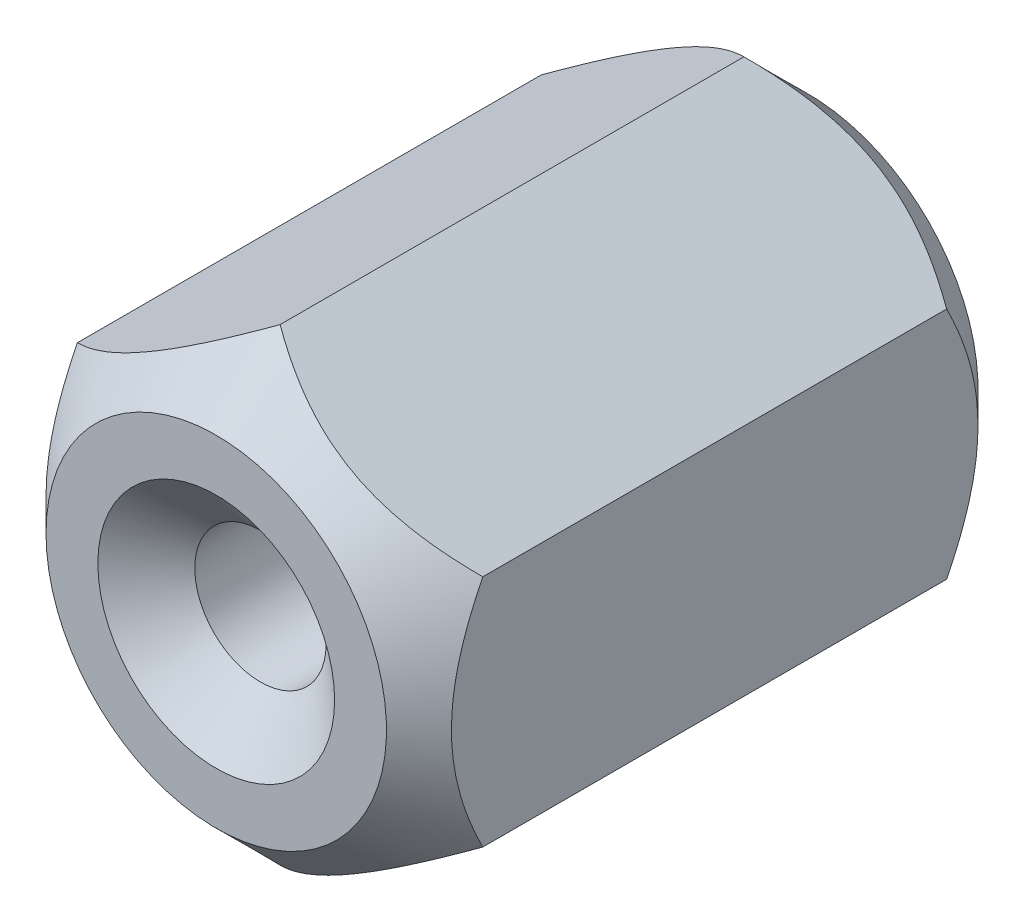
ISO-10303-21;
HEADER;
FILE_DESCRIPTION(('STEP AP214'),'2;1');
FILE_NAME('part.step','',(''),(''),'','','');
FILE_SCHEMA(('AUTOMOTIVE_DESIGN { 1 0 10303 214 1 1 1 1 }'));
ENDSEC;
DATA;
#1=APPLICATION_CONTEXT('core data for automotive mechanical design processes');
#2=APPLICATION_PROTOCOL_DEFINITION('international standard','automotive_design',2000,#1);
#3=PRODUCT_CONTEXT('',#1,'mechanical');
#4=PRODUCT('Part','Part','',(#3));
#5=PRODUCT_RELATED_PRODUCT_CATEGORY('part','',(#4));
#6=PRODUCT_DEFINITION_FORMATION('','',#4);
#7=PRODUCT_DEFINITION_CONTEXT('part definition',#1,'design');
#8=PRODUCT_DEFINITION('design','',#6,#7);
#9=PRODUCT_DEFINITION_SHAPE('','',#8);
#10=(LENGTH_UNIT() NAMED_UNIT(*) SI_UNIT(.MILLI.,.METRE.));
#11=(NAMED_UNIT(*) PLANE_ANGLE_UNIT() SI_UNIT($,.RADIAN.));
#12=(NAMED_UNIT(*) SI_UNIT($,.STERADIAN.) SOLID_ANGLE_UNIT());
#13=UNCERTAINTY_MEASURE_WITH_UNIT(LENGTH_MEASURE(1.E-05),#10,'distance_accuracy_value','');
#14=(GEOMETRIC_REPRESENTATION_CONTEXT(3) GLOBAL_UNCERTAINTY_ASSIGNED_CONTEXT((#13)) GLOBAL_UNIT_ASSIGNED_CONTEXT((#10,
#11,#12)) REPRESENTATION_CONTEXT('',''));
#15=CARTESIAN_POINT('',(0.,0.,0.));
#16=DIRECTION('',(0.,0.,1.));
#17=DIRECTION('',(1.,0.,0.));
#18=AXIS2_PLACEMENT_3D('',#15,#16,#17);
#19=CARTESIAN_POINT('',(0.,-3.66617420935412,-4.6325));
#20=DIRECTION('',(0.5,-0.866025403784439,0.));
#21=DIRECTION('',(0.866025403784439,0.5,0.));
#22=AXIS2_PLACEMENT_3D('',#19,#20,#21);
#23=PLANE('',#22);
#24=CARTESIAN_POINT('',(3.1752,-1.83297163462323,-3.63238452449106));
#25=CARTESIAN_POINT('',(3.06606165005017,-1.89598269034567,-3.69534101630822));
#26=CARTESIAN_POINT('',(2.95509837192205,-1.9600473688431,-3.75459989576525));
#27=CARTESIAN_POINT('',(2.72883215365405,-2.09068223086865,-3.86310134426944));
#28=CARTESIAN_POINT('',(2.61350769674774,-2.15726483710766,-3.91228354606129));
#29=CARTESIAN_POINT('',(2.38096147751937,-2.29152545937819,-3.99653354112599));
#30=CARTESIAN_POINT('',(2.26379893371885,-2.35916928558036,-4.03181308550055));
#31=CARTESIAN_POINT('',(2.02689455535372,-2.49594609220167,-4.08616842986518));
#32=CARTESIAN_POINT('',(1.90715995735644,-2.56507489458671,-4.10528480247036));
#33=CARTESIAN_POINT('',(1.70080208124842,-2.68421566990708,-4.12253286937675));
#34=CARTESIAN_POINT('',(1.61444529227084,-2.73407378526963,-4.12508606638618));
#35=CARTESIAN_POINT('',(1.44187218347528,-2.83370891608764,-4.12078372687673));
#36=CARTESIAN_POINT('',(1.35565592350719,-2.88348589698874,-4.11392489197855));
#37=CARTESIAN_POINT('',(1.18404020841286,-2.98256827629562,-4.09119011669629));
#38=CARTESIAN_POINT('',(1.09864177574672,-3.03187308438379,-4.07530409031272));
#39=CARTESIAN_POINT('',(0.929311596694514,-3.12963590884151,-4.03538201600204));
#40=CARTESIAN_POINT('',(0.845379738380239,-3.17809398983284,-4.01134659291482));
#41=CARTESIAN_POINT('',(0.696376420715872,-3.26412109539651,-3.96189476558283));
#42=CARTESIAN_POINT('',(0.630975148808257,-3.30188053733771,-3.93777828069901));
#43=CARTESIAN_POINT('',(0.501346749794884,-3.3767215284027,-3.88565853286284));
#44=CARTESIAN_POINT('',(0.437119658558268,-3.41380305681743,-3.85765515139647));
#45=CARTESIAN_POINT('',(0.310041965487393,-3.4871713971199,-3.79838943445549));
#46=CARTESIAN_POINT('',(0.24718774925127,-3.52346029578352,-3.76713734664579));
#47=CARTESIAN_POINT('',(0.122643379151904,-3.59536602138645,-3.70178465560807));
#48=CARTESIAN_POINT('',(0.0609525390212886,-3.63098324454239,-3.66768580048145));
#49=CARTESIAN_POINT('',(-0.000200000000000683,-3.66628967940796,-3.63238452449106));
#50=B_SPLINE_CURVE_WITH_KNOTS('',3,(#24,#25,#26,#27,#28,#29,#30,#31,#32,#33,#34,#35,#36,#37,#38,
#39,#40,#41,#42,#43,#44,#45,#46,#47,#48,#49),.UNSPECIFIED.,.F.,.F.,(4,2,2,2,2,2,2,2,2,2,2,2,4),
(0.,0.422910572436808,0.848285055427808,1.26690402276127,1.68446903107506,1.98329272958352,
2.28222117546891,2.58148426995467,2.88072442418453,3.11844134429547,3.35616551414406,
3.59316134346767,3.83001269744429),.UNSPECIFIED.);
#51=CARTESIAN_POINT('',(3.175,-1.83308710467706,-3.6325));
#52=VERTEX_POINT('',#51);
#53=CARTESIAN_POINT('',(0.,-3.66617420935412,-3.6325));
#54=VERTEX_POINT('',#53);
#55=EDGE_CURVE('E214',#52,#54,#50,.T.);
#56=ORIENTED_EDGE('',*,*,#55,.F.);
#57=DIRECTION('',(0.,0.,1.));
#58=VECTOR('',#57,1.);
#59=CARTESIAN_POINT('',(3.175,-1.83308710467706,-4.6325));
#60=LINE('',#59,#58);
#61=CARTESIAN_POINT('',(3.175,-1.83308710467706,3.6325));
#62=VERTEX_POINT('',#61);
#63=EDGE_CURVE('E43',#52,#62,#60,.T.);
#64=ORIENTED_EDGE('',*,*,#63,.T.);
#65=CARTESIAN_POINT('',(-0.000200000000000684,-3.66628967940796,3.63238452449106));
#66=CARTESIAN_POINT('',(0.108938349949826,-3.60327862368552,3.69534101630822));
#67=CARTESIAN_POINT('',(0.219901628077945,-3.53921394518808,3.75459989576526));
#68=CARTESIAN_POINT('',(0.446167846345948,-3.40857908316253,3.86310134426944));
#69=CARTESIAN_POINT('',(0.561492303252265,-3.34199647692353,3.91228354606129));
#70=CARTESIAN_POINT('',(0.794038522480629,-3.207735854653,3.99653354112599));
#71=CARTESIAN_POINT('',(0.911201066281154,-3.14009202845083,4.03181308550055));
#72=CARTESIAN_POINT('',(1.14810544464629,-3.00331522182952,4.08616842986518));
#73=CARTESIAN_POINT('',(1.26784004264356,-2.93418641944448,4.10528480247036));
#74=CARTESIAN_POINT('',(1.47419791875159,-2.81504564412411,4.12253286937675));
#75=CARTESIAN_POINT('',(1.56055470772916,-2.76518752876155,4.12508606638618));
#76=CARTESIAN_POINT('',(1.73312781652473,-2.66555239794355,4.12078372687673));
#77=CARTESIAN_POINT('',(1.81934407649281,-2.61577541704245,4.11392489197855));
#78=CARTESIAN_POINT('',(1.99095979158714,-2.51669303773557,4.09119011669629));
#79=CARTESIAN_POINT('',(2.07635822425329,-2.4673882296474,4.07530409031271));
#80=CARTESIAN_POINT('',(2.24568840330549,-2.36962540518968,4.03538201600204));
#81=CARTESIAN_POINT('',(2.32962026161976,-2.32116732419835,4.01134659291482));
#82=CARTESIAN_POINT('',(2.47862357928413,-2.23514021863468,3.96189476558283));
#83=CARTESIAN_POINT('',(2.54402485119175,-2.19738077669347,3.937778280699));
#84=CARTESIAN_POINT('',(2.67365325020512,-2.12253978562848,3.88565853286284));
#85=CARTESIAN_POINT('',(2.73788034144173,-2.08545825721376,3.85765515139647));
#86=CARTESIAN_POINT('',(2.86495803451261,-2.01208991691129,3.79838943445549));
#87=CARTESIAN_POINT('',(2.92781225074873,-1.97580101824766,3.76713734664579));
#88=CARTESIAN_POINT('',(3.0523566208481,-1.90389529264474,3.70178465560807));
#89=CARTESIAN_POINT('',(3.11404746097871,-1.8682780694888,3.66768580048145));
#90=CARTESIAN_POINT('',(3.1752,-1.83297163462323,3.63238452449106));
#91=B_SPLINE_CURVE_WITH_KNOTS('',3,(#65,#66,#67,#68,#69,#70,#71,#72,#73,#74,#75,#76,#77,#78,#79,
#80,#81,#82,#83,#84,#85,#86,#87,#88,#89,#90),.UNSPECIFIED.,.F.,.F.,(4,2,2,2,2,2,2,2,2,2,2,2,4),
(0.,0.42291057243681,0.848285055427811,1.26690402276128,1.68446903107507,1.98329272958353,
2.28222117546892,2.58148426995467,2.88072442418454,3.11844134429547,3.35616551414406,
3.59316134346767,3.83001269744429),.UNSPECIFIED.);
#92=CARTESIAN_POINT('',(0.,-3.66617420935412,3.6325));
#93=VERTEX_POINT('',#92);
#94=EDGE_CURVE('E131',#93,#62,#91,.T.);
#95=ORIENTED_EDGE('',*,*,#94,.F.);
#96=DIRECTION('',(0.,0.,1.));
#97=VECTOR('',#96,1.);
#98=CARTESIAN_POINT('',(0.,-3.66617420935412,-4.6325));
#99=LINE('',#98,#97);
#100=EDGE_CURVE('E11',#54,#93,#99,.T.);
#101=ORIENTED_EDGE('',*,*,#100,.F.);
#102=EDGE_LOOP('',(#56,#64,#95,#101));
#103=FACE_BOUND('',#102,.T.);
#104=ADVANCED_FACE('F39',(#103),#23,.T.);
#105=CARTESIAN_POINT('',(-3.175,-1.83308710467706,-4.6325));
#106=DIRECTION('',(-0.5,-0.866025403784438,0.));
#107=DIRECTION('',(0.866025403784439,-0.5,0.));
#108=AXIS2_PLACEMENT_3D('',#105,#106,#107);
#109=PLANE('',#108);
#110=CARTESIAN_POINT('',(0.000199999999999404,-3.66628967940796,-3.63238452449106));
#111=CARTESIAN_POINT('',(-0.108938349949827,-3.60327862368552,-3.69534101630822));
#112=CARTESIAN_POINT('',(-0.219901628077947,-3.53921394518808,-3.75459989576526));
#113=CARTESIAN_POINT('',(-0.446167846345949,-3.40857908316253,-3.86310134426944));
#114=CARTESIAN_POINT('',(-0.561492303252266,-3.34199647692352,-3.91228354606129));
#115=CARTESIAN_POINT('',(-0.79403852248063,-3.207735854653,-3.996533541126));
#116=CARTESIAN_POINT('',(-0.911201066281154,-3.14009202845082,-4.03181308550055));
#117=CARTESIAN_POINT('',(-1.14810544464629,-3.00331522182951,-4.08616842986518));
#118=CARTESIAN_POINT('',(-1.26784004264356,-2.93418641944448,-4.10528480247036));
#119=CARTESIAN_POINT('',(-1.47419791875159,-2.81504564412411,-4.12253286937675));
#120=CARTESIAN_POINT('',(-1.56055470772916,-2.76518752876155,-4.12508606638618));
#121=CARTESIAN_POINT('',(-1.73312781652473,-2.66555239794354,-4.12078372687673));
#122=CARTESIAN_POINT('',(-1.81934407649281,-2.61577541704245,-4.11392489197855));
#123=CARTESIAN_POINT('',(-1.99095979158714,-2.51669303773557,-4.09119011669629));
#124=CARTESIAN_POINT('',(-2.07635822425329,-2.46738822964739,-4.07530409031272));
#125=CARTESIAN_POINT('',(-2.24568840330549,-2.36962540518968,-4.03538201600204));
#126=CARTESIAN_POINT('',(-2.32962026161976,-2.32116732419835,-4.01134659291482));
#127=CARTESIAN_POINT('',(-2.47862357928413,-2.23514021863468,-3.96189476558283));
#128=CARTESIAN_POINT('',(-2.54402485119175,-2.19738077669347,-3.93777828069901));
#129=CARTESIAN_POINT('',(-2.67365325020512,-2.12253978562848,-3.88565853286284));
#130=CARTESIAN_POINT('',(-2.73788034144173,-2.08545825721375,-3.85765515139647));
#131=CARTESIAN_POINT('',(-2.86495803451261,-2.01208991691129,-3.79838943445549));
#132=CARTESIAN_POINT('',(-2.92781225074873,-1.97580101824766,-3.76713734664579));
#133=CARTESIAN_POINT('',(-3.0523566208481,-1.90389529264474,-3.70178465560807));
#134=CARTESIAN_POINT('',(-3.11404746097871,-1.86827806948879,-3.66768580048145));
#135=CARTESIAN_POINT('',(-3.1752,-1.83297163462322,-3.63238452449106));
#136=B_SPLINE_CURVE_WITH_KNOTS('',3,(#110,#111,#112,#113,#114,#115,#116,#117,#118,#119,#120,
#121,#122,#123,#124,#125,#126,#127,#128,#129,#130,#131,#132,#133,#134,#135),.UNSPECIFIED.,.F.,
.F.,(4,2,2,2,2,2,2,2,2,2,2,2,4),(0.,0.42291057243681,0.848285055427811,1.26690402276128,
1.68446903107507,1.98329272958352,2.28222117546891,2.58148426995467,2.88072442418453,
3.11844134429547,3.35616551414406,3.59316134346767,3.83001269744429),.UNSPECIFIED.);
#137=CARTESIAN_POINT('',(-3.175,-1.83308710467706,-3.6325));
#138=VERTEX_POINT('',#137);
#139=EDGE_CURVE('E99',#54,#138,#136,.T.);
#140=ORIENTED_EDGE('',*,*,#139,.F.);
#141=ORIENTED_EDGE('',*,*,#100,.T.);
#142=CARTESIAN_POINT('',(-3.1752,-1.83297163462322,3.63238452449106));
#143=CARTESIAN_POINT('',(-3.06606165005017,-1.89598269034567,3.69534101630822));
#144=CARTESIAN_POINT('',(-2.95509837192205,-1.9600473688431,3.75459989576526));
#145=CARTESIAN_POINT('',(-2.72883215365405,-2.09068223086865,3.86310134426944));
#146=CARTESIAN_POINT('',(-2.61350769674773,-2.15726483710766,3.91228354606129));
#147=CARTESIAN_POINT('',(-2.38096147751937,-2.29152545937819,3.996533541126));
#148=CARTESIAN_POINT('',(-2.26379893371885,-2.35916928558036,4.03181308550055));
#149=CARTESIAN_POINT('',(-2.02689455535371,-2.49594609220167,4.08616842986518));
#150=CARTESIAN_POINT('',(-1.90715995735644,-2.56507489458671,4.10528480247036));
#151=CARTESIAN_POINT('',(-1.70080208124841,-2.68421566990708,4.12253286937675));
#152=CARTESIAN_POINT('',(-1.61444529227084,-2.73407378526963,4.12508606638618));
#153=CARTESIAN_POINT('',(-1.44187218347527,-2.83370891608764,4.12078372687673));
#154=CARTESIAN_POINT('',(-1.35565592350719,-2.88348589698874,4.11392489197855));
#155=CARTESIAN_POINT('',(-1.18404020841286,-2.98256827629562,4.09119011669629));
#156=CARTESIAN_POINT('',(-1.09864177574671,-3.03187308438379,4.07530409031272));
#157=CARTESIAN_POINT('',(-0.929311596694512,-3.12963590884151,4.03538201600204));
#158=CARTESIAN_POINT('',(-0.845379738380237,-3.17809398983284,4.01134659291482));
#159=CARTESIAN_POINT('',(-0.69637642071587,-3.26412109539651,3.96189476558283));
#160=CARTESIAN_POINT('',(-0.630975148808255,-3.30188053733771,3.93777828069901));
#161=CARTESIAN_POINT('',(-0.501346749794883,-3.3767215284027,3.88565853286284));
#162=CARTESIAN_POINT('',(-0.437119658558267,-3.41380305681743,3.85765515139647));
#163=CARTESIAN_POINT('',(-0.310041965487394,-3.4871713971199,3.79838943445549));
#164=CARTESIAN_POINT('',(-0.247187749251271,-3.52346029578352,3.76713734664579));
#165=CARTESIAN_POINT('',(-0.122643379151905,-3.59536602138645,3.70178465560807));
#166=CARTESIAN_POINT('',(-0.06095253902129,-3.63098324454239,3.66768580048145));
#167=CARTESIAN_POINT('',(0.000199999999999069,-3.66628967940796,3.63238452449106));
#168=B_SPLINE_CURVE_WITH_KNOTS('',3,(#142,#143,#144,#145,#146,#147,#148,#149,#150,#151,#152,
#153,#154,#155,#156,#157,#158,#159,#160,#161,#162,#163,#164,#165,#166,#167),.UNSPECIFIED.,.F.,
.F.,(4,2,2,2,2,2,2,2,2,2,2,2,4),(0.,0.42291057243681,0.848285055427811,1.26690402276128,
1.68446903107507,1.98329272958352,2.28222117546891,2.58148426995467,2.88072442418453,
3.11844134429547,3.35616551414406,3.59316134346767,3.83001269744429),.UNSPECIFIED.);
#169=CARTESIAN_POINT('',(-3.175,-1.83308710467706,3.6325));
#170=VERTEX_POINT('',#169);
#171=EDGE_CURVE('E133',#170,#93,#168,.T.);
#172=ORIENTED_EDGE('',*,*,#171,.F.);
#173=DIRECTION('',(0.,0.,1.));
#174=VECTOR('',#173,1.);
#175=CARTESIAN_POINT('',(-3.175,-1.83308710467706,-4.6325));
#176=LINE('',#175,#174);
#177=EDGE_CURVE('E49',#138,#170,#176,.T.);
#178=ORIENTED_EDGE('',*,*,#177,.F.);
#179=EDGE_LOOP('',(#140,#141,#172,#178));
#180=FACE_BOUND('',#179,.T.);
#181=ADVANCED_FACE('F194',(#180),#109,.T.);
#182=CARTESIAN_POINT('',(-3.175,1.83308710467706,-4.6325));
#183=DIRECTION('',(-1.,0.,0.));
#184=DIRECTION('',(0.,-1.,0.));
#185=AXIS2_PLACEMENT_3D('',#182,#183,#184);
#186=PLANE('',#185);
#187=CARTESIAN_POINT('',(-3.175,-3.62314366162436,-2.48122727215091));
#188=CARTESIAN_POINT('',(-3.175,-3.53477477471413,-2.54767330066197));
#189=CARTESIAN_POINT('',(-3.175,-3.44590747401783,-2.61346732929089));
#190=CARTESIAN_POINT('',(-3.175,-3.26698086109357,-2.74346065674581));
#191=CARTESIAN_POINT('',(-3.175,-3.17692125186334,-2.80765954631578));
#192=CARTESIAN_POINT('',(-3.175,-2.99475622996979,-2.93462801376402));
#193=CARTESIAN_POINT('',(-3.175,-2.90264037042889,-2.99738265440275));
#194=CARTESIAN_POINT('',(-3.175,-2.71683951537136,-3.1205168325571));
#195=CARTESIAN_POINT('',(-3.175,-2.62315463201829,-3.18089653882317));
#196=CARTESIAN_POINT('',(-3.175,-2.42867521304995,-3.30205311497214));
#197=CARTESIAN_POINT('',(-3.175,-2.327776197965,-3.36266312895682));
#198=CARTESIAN_POINT('',(-3.175,-2.1236266416231,-3.47984891241029));
#199=CARTESIAN_POINT('',(-3.175,-2.02037573570296,-3.53642405057174));
#200=CARTESIAN_POINT('',(-3.175,-1.81153946353305,-3.64431638181168));
#201=CARTESIAN_POINT('',(-3.175,-1.70596214797143,-3.69564903574252));
#202=CARTESIAN_POINT('',(-3.175,-1.49194968831593,-3.79190753599678));
#203=CARTESIAN_POINT('',(-3.175,-1.38351585328126,-3.83683625855787));
#204=CARTESIAN_POINT('',(-3.175,-1.17206906194383,-3.91555402653428));
#205=CARTESIAN_POINT('',(-3.175,-1.06927808219159,-3.9499331189904));
#206=CARTESIAN_POINT('',(-3.175,-0.861249989752693,-4.01044018821902));
#207=CARTESIAN_POINT('',(-3.175,-0.756012706347597,-4.03656758726936));
#208=CARTESIAN_POINT('',(-3.175,-0.545455116385145,-4.07878154980003));
#209=CARTESIAN_POINT('',(-3.175,-0.440169465308187,-4.09503816718227));
#210=CARTESIAN_POINT('',(-3.175,-0.228508692793317,-4.11720019179704));
#211=CARTESIAN_POINT('',(-3.175,-0.122133754622792,-4.12310731241113));
#212=CARTESIAN_POINT('',(-3.175,0.086957796837713,-4.12414473816365));
#213=CARTESIAN_POINT('',(-3.175,0.189672720284836,-4.11964340706931));
#214=CARTESIAN_POINT('',(-3.175,0.394206632826208,-4.10091780352249));
#215=CARTESIAN_POINT('',(-3.175,0.496025532914314,-4.08669257595037));
#216=CARTESIAN_POINT('',(-3.175,0.699751411908735,-4.04904774602645));
#217=CARTESIAN_POINT('',(-3.175,0.801629229158969,-4.0254728022883));
#218=CARTESIAN_POINT('',(-3.175,1.00316901022372,-3.97037603830061));
#219=CARTESIAN_POINT('',(-3.175,1.10283116972946,-3.93885492293116));
#220=CARTESIAN_POINT('',(-3.175,1.30972972723242,-3.865639745003));
#221=CARTESIAN_POINT('',(-3.175,1.41671377003006,-3.82323954984725));
#222=CARTESIAN_POINT('',(-3.175,1.62788222750015,-3.7319455092361));
#223=CARTESIAN_POINT('',(-3.175,1.73206568079257,-3.68304946728032));
#224=CARTESIAN_POINT('',(-3.175,1.93816752656033,-3.5799201972936));
#225=CARTESIAN_POINT('',(-3.175,2.04007726416977,-3.52566981162605));
#226=CARTESIAN_POINT('',(-3.175,2.24154914453307,-3.41303481703511));
#227=CARTESIAN_POINT('',(-3.175,2.34111165997837,-3.35465087041164));
#228=CARTESIAN_POINT('',(-3.175,2.53328789139578,-3.23755822864378));
#229=CARTESIAN_POINT('',(-3.175,2.62600050272272,-3.17901098750221));
#230=CARTESIAN_POINT('',(-3.175,2.80983442239984,-3.05946182904578));
#231=CARTESIAN_POINT('',(-3.175,2.90095560921207,-2.99845972541707));
#232=CARTESIAN_POINT('',(-3.175,3.08107470813498,-2.87494540123562));
#233=CARTESIAN_POINT('',(-3.175,3.1700838687153,-2.81244952545103));
#234=CARTESIAN_POINT('',(-3.175,3.34688695470737,-2.68581054967444));
#235=CARTESIAN_POINT('',(-3.175,3.43468120733686,-2.62166790704841));
#236=CARTESIAN_POINT('',(-3.175,3.52196693533842,-2.55685218679603));
#237=B_SPLINE_CURVE_WITH_KNOTS('',3,(#187,#188,#189,#190,#191,#192,#193,#194,#195,#196,#197,
#198,#199,#200,#201,#202,#203,#204,#205,#206,#207,#208,#209,#210,#211,#212,#213,#214,#215,#216,
#217,#218,#219,#220,#221,#222,#223,#224,#225,#226,#227,#228,#229,#230,#231,#232,#233,#234,#235,
#236),.UNSPECIFIED.,.F.,.F.,(4,2,2,2,2,2,2,2,2,2,2,2,2,2,2,2,2,2,2,2,2,2,2,2,4),(0.,
0.331695086033258,0.663474412411203,0.997825593478521,1.33215297421855,1.68518935827853,
2.03828085871132,2.39029899374214,2.74215852308448,3.06703502033416,3.39193425797894,
3.71106436530982,4.03014163496714,4.33810010599997,4.64608883028139,4.95942473763719,
5.27273285971666,5.61770254927929,5.96278918493366,6.30901993384334,6.65519533292016,
6.98410375942931,7.31303719597191,7.63929174244195,7.96545663622252),.UNSPECIFIED.);
#238=CARTESIAN_POINT('',(-3.175,1.83308710467706,-3.6325));
#239=VERTEX_POINT('',#238);
#240=EDGE_CURVE('E93',#138,#239,#237,.T.);
#241=ORIENTED_EDGE('',*,*,#240,.F.);
#242=ORIENTED_EDGE('',*,*,#177,.T.);
#243=CARTESIAN_POINT('',(-3.175,-3.62314366162436,2.48122727215091));
#244=CARTESIAN_POINT('',(-3.175,-3.53477477471413,2.54767330066197));
#245=CARTESIAN_POINT('',(-3.175,-3.44590747401783,2.61346732929089));
#246=CARTESIAN_POINT('',(-3.175,-3.26698086109357,2.74346065674581));
#247=CARTESIAN_POINT('',(-3.175,-3.17692125186334,2.80765954631578));
#248=CARTESIAN_POINT('',(-3.175,-2.99475622996979,2.93462801376402));
#249=CARTESIAN_POINT('',(-3.175,-2.90264037042889,2.99738265440275));
#250=CARTESIAN_POINT('',(-3.175,-2.71683951537136,3.1205168325571));
#251=CARTESIAN_POINT('',(-3.175,-2.62315463201829,3.18089653882317));
#252=CARTESIAN_POINT('',(-3.175,-2.42867521304995,3.30205311497214));
#253=CARTESIAN_POINT('',(-3.175,-2.327776197965,3.36266312895682));
#254=CARTESIAN_POINT('',(-3.175,-2.1236266416231,3.47984891241029));
#255=CARTESIAN_POINT('',(-3.175,-2.02037573570296,3.53642405057174));
#256=CARTESIAN_POINT('',(-3.175,-1.81153946353305,3.64431638181168));
#257=CARTESIAN_POINT('',(-3.175,-1.70596214797143,3.69564903574252));
#258=CARTESIAN_POINT('',(-3.175,-1.49194968831593,3.79190753599678));
#259=CARTESIAN_POINT('',(-3.175,-1.38351585328126,3.83683625855787));
#260=CARTESIAN_POINT('',(-3.175,-1.17206906194383,3.91555402653428));
#261=CARTESIAN_POINT('',(-3.175,-1.06927808219159,3.9499331189904));
#262=CARTESIAN_POINT('',(-3.175,-0.861249989752693,4.01044018821902));
#263=CARTESIAN_POINT('',(-3.175,-0.756012706347597,4.03656758726936));
#264=CARTESIAN_POINT('',(-3.175,-0.545455116385145,4.07878154980003));
#265=CARTESIAN_POINT('',(-3.175,-0.440169465308187,4.09503816718227));
#266=CARTESIAN_POINT('',(-3.175,-0.228508692793317,4.11720019179704));
#267=CARTESIAN_POINT('',(-3.175,-0.122133754622792,4.12310731241113));
#268=CARTESIAN_POINT('',(-3.175,0.086957796837713,4.12414473816365));
#269=CARTESIAN_POINT('',(-3.175,0.189672720284836,4.11964340706931));
#270=CARTESIAN_POINT('',(-3.175,0.394206632826208,4.10091780352249));
#271=CARTESIAN_POINT('',(-3.175,0.496025532914314,4.08669257595037));
#272=CARTESIAN_POINT('',(-3.175,0.699751411908735,4.04904774602645));
#273=CARTESIAN_POINT('',(-3.175,0.801629229158969,4.0254728022883));
#274=CARTESIAN_POINT('',(-3.175,1.00316901022372,3.97037603830061));
#275=CARTESIAN_POINT('',(-3.175,1.10283116972946,3.93885492293116));
#276=CARTESIAN_POINT('',(-3.175,1.30972972723242,3.865639745003));
#277=CARTESIAN_POINT('',(-3.175,1.41671377003006,3.82323954984725));
#278=CARTESIAN_POINT('',(-3.175,1.62788222750015,3.7319455092361));
#279=CARTESIAN_POINT('',(-3.175,1.73206568079257,3.68304946728032));
#280=CARTESIAN_POINT('',(-3.175,1.93816752656033,3.5799201972936));
#281=CARTESIAN_POINT('',(-3.175,2.04007726416977,3.52566981162605));
#282=CARTESIAN_POINT('',(-3.175,2.24154914453307,3.41303481703511));
#283=CARTESIAN_POINT('',(-3.175,2.34111165997837,3.35465087041164));
#284=CARTESIAN_POINT('',(-3.175,2.53328789139578,3.23755822864378));
#285=CARTESIAN_POINT('',(-3.175,2.62600050272272,3.17901098750221));
#286=CARTESIAN_POINT('',(-3.175,2.80983442239984,3.05946182904578));
#287=CARTESIAN_POINT('',(-3.175,2.90095560921207,2.99845972541707));
#288=CARTESIAN_POINT('',(-3.175,3.08107470813498,2.87494540123562));
#289=CARTESIAN_POINT('',(-3.175,3.1700838687153,2.81244952545103));
#290=CARTESIAN_POINT('',(-3.175,3.34688695470737,2.68581054967444));
#291=CARTESIAN_POINT('',(-3.175,3.43468120733686,2.62166790704841));
#292=CARTESIAN_POINT('',(-3.175,3.52196693533842,2.55685218679603));
#293=B_SPLINE_CURVE_WITH_KNOTS('',3,(#243,#244,#245,#246,#247,#248,#249,#250,#251,#252,#253,
#254,#255,#256,#257,#258,#259,#260,#261,#262,#263,#264,#265,#266,#267,#268,#269,#270,#271,#272,
#273,#274,#275,#276,#277,#278,#279,#280,#281,#282,#283,#284,#285,#286,#287,#288,#289,#290,#291,
#292),.UNSPECIFIED.,.F.,.F.,(4,2,2,2,2,2,2,2,2,2,2,2,2,2,2,2,2,2,2,2,2,2,2,2,4),(0.,
0.331695086033258,0.663474412411203,0.997825593478521,1.33215297421855,1.68518935827853,
2.03828085871132,2.39029899374214,2.74215852308448,3.06703502033416,3.39193425797894,
3.71106436530982,4.03014163496714,4.33810010599997,4.64608883028139,4.95942473763719,
5.27273285971666,5.61770254927929,5.96278918493366,6.30901993384334,6.65519533292016,
6.98410375942931,7.31303719597191,7.63929174244195,7.96545663622252),.UNSPECIFIED.);
#294=CARTESIAN_POINT('',(-3.175,1.83308710467706,3.6325));
#295=VERTEX_POINT('',#294);
#296=EDGE_CURVE('E117',#295,#170,#293,.F.);
#297=ORIENTED_EDGE('',*,*,#296,.F.);
#298=DIRECTION('',(0.,0.,1.));
#299=VECTOR('',#298,1.);
#300=CARTESIAN_POINT('',(-3.175,1.83308710467706,-4.6325));
#301=LINE('',#300,#299);
#302=EDGE_CURVE('E109',#239,#295,#301,.T.);
#303=ORIENTED_EDGE('',*,*,#302,.F.);
#304=EDGE_LOOP('',(#241,#242,#297,#303));
#305=FACE_BOUND('',#304,.T.);
#306=ADVANCED_FACE('F115',(#305),#186,.T.);
#307=CARTESIAN_POINT('',(0.,3.66617420935412,-4.6325));
#308=DIRECTION('',(-0.5,0.866025403784439,0.));
#309=DIRECTION('',(-0.866025403784439,-0.5,0.));
#310=AXIS2_PLACEMENT_3D('',#307,#308,#309);
#311=PLANE('',#310);
#312=CARTESIAN_POINT('',(-3.1752,1.83297163462323,-3.63238452449106));
#313=CARTESIAN_POINT('',(-3.06606165005017,1.89598269034567,-3.69534101630822));
#314=CARTESIAN_POINT('',(-2.95509837192205,1.9600473688431,-3.75459989576526));
#315=CARTESIAN_POINT('',(-2.72883215365405,2.09068223086865,-3.86310134426944));
#316=CARTESIAN_POINT('',(-2.61350769674773,2.15726483710766,-3.91228354606129));
#317=CARTESIAN_POINT('',(-2.38096147751937,2.29152545937819,-3.996533541126));
#318=CARTESIAN_POINT('',(-2.26379893371884,2.35916928558036,-4.03181308550055));
#319=CARTESIAN_POINT('',(-2.02689455535371,2.49594609220167,-4.08616842986518));
#320=CARTESIAN_POINT('',(-1.90715995735644,2.56507489458671,-4.10528480247036));
#321=CARTESIAN_POINT('',(-1.70080208124841,2.68421566990708,-4.12253286937675));
#322=CARTESIAN_POINT('',(-1.61444529227084,2.73407378526963,-4.12508606638618));
#323=CARTESIAN_POINT('',(-1.44187218347527,2.83370891608764,-4.12078372687673));
#324=CARTESIAN_POINT('',(-1.35565592350718,2.88348589698874,-4.11392489197855));
#325=CARTESIAN_POINT('',(-1.18404020841286,2.98256827629562,-4.09119011669629));
#326=CARTESIAN_POINT('',(-1.09864177574671,3.03187308438379,-4.07530409031272));
#327=CARTESIAN_POINT('',(-0.92931159669451,3.12963590884151,-4.03538201600204));
#328=CARTESIAN_POINT('',(-0.845379738380234,3.17809398983284,-4.01134659291482));
#329=CARTESIAN_POINT('',(-0.696376420715867,3.26412109539651,-3.96189476558283));
#330=CARTESIAN_POINT('',(-0.630975148808252,3.30188053733771,-3.937778280699));
#331=CARTESIAN_POINT('',(-0.50134674979488,3.37672152840271,-3.88565853286284));
#332=CARTESIAN_POINT('',(-0.437119658558265,3.41380305681743,-3.85765515139647));
#333=CARTESIAN_POINT('',(-0.310041965487391,3.4871713971199,-3.79838943445549));
#334=CARTESIAN_POINT('',(-0.247187749251269,3.52346029578353,-3.76713734664579));
#335=CARTESIAN_POINT('',(-0.122643379151903,3.59536602138645,-3.70178465560807));
#336=CARTESIAN_POINT('',(-0.0609525390212875,3.63098324454239,-3.66768580048145));
#337=CARTESIAN_POINT('',(0.000200000000001464,3.66628967940796,-3.63238452449106));
#338=B_SPLINE_CURVE_WITH_KNOTS('',3,(#312,#313,#314,#315,#316,#317,#318,#319,#320,#321,#322,
#323,#324,#325,#326,#327,#328,#329,#330,#331,#332,#333,#334,#335,#336,#337),.UNSPECIFIED.,.F.,
.F.,(4,2,2,2,2,2,2,2,2,2,2,2,4),(0.,0.42291057243681,0.848285055427812,1.26690402276128,
1.68446903107507,1.98329272958353,2.28222117546892,2.58148426995467,2.88072442418454,
3.11844134429547,3.35616551414406,3.59316134346767,3.83001269744429),.UNSPECIFIED.);
#339=CARTESIAN_POINT('',(0.,3.66617420935412,-3.6325));
#340=VERTEX_POINT('',#339);
#341=EDGE_CURVE('E97',#239,#340,#338,.T.);
#342=ORIENTED_EDGE('',*,*,#341,.F.);
#343=ORIENTED_EDGE('',*,*,#302,.T.);
#344=CARTESIAN_POINT('',(0.000200000000001578,3.66628967940796,3.63238452449106));
#345=CARTESIAN_POINT('',(-0.108938349949825,3.60327862368552,3.69534101630822));
#346=CARTESIAN_POINT('',(-0.219901628077945,3.53921394518808,3.75459989576526));
#347=CARTESIAN_POINT('',(-0.446167846345948,3.40857908316253,3.86310134426944));
#348=CARTESIAN_POINT('',(-0.561492303252265,3.34199647692353,3.91228354606129));
#349=CARTESIAN_POINT('',(-0.794038522480629,3.207735854653,3.996533541126));
#350=CARTESIAN_POINT('',(-0.911201066281154,3.14009202845083,4.03181308550055));
#351=CARTESIAN_POINT('',(-1.14810544464629,3.00331522182952,4.08616842986518));
#352=CARTESIAN_POINT('',(-1.26784004264356,2.93418641944448,4.10528480247036));
#353=CARTESIAN_POINT('',(-1.47419791875159,2.81504564412411,4.12253286937675));
#354=CARTESIAN_POINT('',(-1.56055470772916,2.76518752876155,4.12508606638618));
#355=CARTESIAN_POINT('',(-1.73312781652473,2.66555239794354,4.12078372687673));
#356=CARTESIAN_POINT('',(-1.81934407649281,2.61577541704245,4.11392489197855));
#357=CARTESIAN_POINT('',(-1.99095979158714,2.51669303773557,4.09119011669629));
#358=CARTESIAN_POINT('',(-2.07635822425329,2.4673882296474,4.07530409031272));
#359=CARTESIAN_POINT('',(-2.24568840330549,2.36962540518968,4.03538201600204));
#360=CARTESIAN_POINT('',(-2.32962026161976,2.32116732419835,4.01134659291482));
#361=CARTESIAN_POINT('',(-2.47862357928413,2.23514021863468,3.96189476558283));
#362=CARTESIAN_POINT('',(-2.54402485119175,2.19738077669347,3.937778280699));
#363=CARTESIAN_POINT('',(-2.67365325020512,2.12253978562848,3.88565853286284));
#364=CARTESIAN_POINT('',(-2.73788034144173,2.08545825721376,3.85765515139647));
#365=CARTESIAN_POINT('',(-2.86495803451261,2.01208991691129,3.79838943445549));
#366=CARTESIAN_POINT('',(-2.92781225074873,1.97580101824766,3.76713734664579));
#367=CARTESIAN_POINT('',(-3.0523566208481,1.90389529264474,3.70178465560807));
#368=CARTESIAN_POINT('',(-3.11404746097871,1.8682780694888,3.66768580048145));
#369=CARTESIAN_POINT('',(-3.1752,1.83297163462323,3.63238452449106));
#370=B_SPLINE_CURVE_WITH_KNOTS('',3,(#344,#345,#346,#347,#348,#349,#350,#351,#352,#353,#354,
#355,#356,#357,#358,#359,#360,#361,#362,#363,#364,#365,#366,#367,#368,#369),.UNSPECIFIED.,.F.,
.F.,(4,2,2,2,2,2,2,2,2,2,2,2,4),(0.,0.42291057243681,0.848285055427812,1.26690402276128,
1.68446903107507,1.98329272958353,2.28222117546892,2.58148426995467,2.88072442418454,
3.11844134429547,3.35616551414406,3.59316134346767,3.83001269744429),.UNSPECIFIED.);
#371=CARTESIAN_POINT('',(0.,3.66617420935412,3.6325));
#372=VERTEX_POINT('',#371);
#373=EDGE_CURVE('E180',#372,#295,#370,.T.);
#374=ORIENTED_EDGE('',*,*,#373,.F.);
#375=DIRECTION('',(0.,0.,1.));
#376=VECTOR('',#375,1.);
#377=CARTESIAN_POINT('',(0.,3.66617420935412,-4.6325));
#378=LINE('',#377,#376);
#379=EDGE_CURVE('E111',#340,#372,#378,.T.);
#380=ORIENTED_EDGE('',*,*,#379,.F.);
#381=EDGE_LOOP('',(#342,#343,#374,#380));
#382=FACE_BOUND('',#381,.T.);
#383=ADVANCED_FACE('F107',(#382),#311,.T.);
#384=CARTESIAN_POINT('',(3.175,1.83308710467706,-4.6325));
#385=DIRECTION('',(0.5,0.866025403784438,0.));
#386=DIRECTION('',(-0.866025403784438,0.5,0.));
#387=AXIS2_PLACEMENT_3D('',#384,#385,#386);
#388=PLANE('',#387);
#389=CARTESIAN_POINT('',(-0.000199999999998509,3.66628967940796,-3.63238452449106));
#390=CARTESIAN_POINT('',(0.108938349949828,3.60327862368552,-3.69534101630822));
#391=CARTESIAN_POINT('',(0.219901628077948,3.53921394518808,-3.75459989576526));
#392=CARTESIAN_POINT('',(0.44616784634595,3.40857908316253,-3.86310134426944));
#393=CARTESIAN_POINT('',(0.561492303252267,3.34199647692353,-3.91228354606129));
#394=CARTESIAN_POINT('',(0.794038522480631,3.207735854653,-3.99653354112599));
#395=CARTESIAN_POINT('',(0.911201066281155,3.14009202845083,-4.03181308550055));
#396=CARTESIAN_POINT('',(1.14810544464629,3.00331522182952,-4.08616842986518));
#397=CARTESIAN_POINT('',(1.26784004264356,2.93418641944448,-4.10528480247036));
#398=CARTESIAN_POINT('',(1.47419791875159,2.81504564412411,-4.12253286937675));
#399=CARTESIAN_POINT('',(1.56055470772916,2.76518752876155,-4.12508606638618));
#400=CARTESIAN_POINT('',(1.73312781652473,2.66555239794354,-4.12078372687673));
#401=CARTESIAN_POINT('',(1.81934407649282,2.61577541704245,-4.11392489197855));
#402=CARTESIAN_POINT('',(1.99095979158714,2.51669303773557,-4.09119011669629));
#403=CARTESIAN_POINT('',(2.07635822425329,2.4673882296474,-4.07530409031272));
#404=CARTESIAN_POINT('',(2.24568840330549,2.36962540518968,-4.03538201600204));
#405=CARTESIAN_POINT('',(2.32962026161976,2.32116732419835,-4.01134659291482));
#406=CARTESIAN_POINT('',(2.47862357928413,2.23514021863468,-3.96189476558283));
#407=CARTESIAN_POINT('',(2.54402485119175,2.19738077669347,-3.937778280699));
#408=CARTESIAN_POINT('',(2.67365325020512,2.12253978562848,-3.88565853286284));
#409=CARTESIAN_POINT('',(2.73788034144173,2.08545825721375,-3.85765515139647));
#410=CARTESIAN_POINT('',(2.86495803451261,2.01208991691129,-3.79838943445549));
#411=CARTESIAN_POINT('',(2.92781225074873,1.97580101824766,-3.76713734664579));
#412=CARTESIAN_POINT('',(3.0523566208481,1.90389529264474,-3.70178465560807));
#413=CARTESIAN_POINT('',(3.11404746097871,1.86827806948879,-3.66768580048145));
#414=CARTESIAN_POINT('',(3.1752,1.83297163462322,-3.63238452449106));
#415=B_SPLINE_CURVE_WITH_KNOTS('',3,(#389,#390,#391,#392,#393,#394,#395,#396,#397,#398,#399,
#400,#401,#402,#403,#404,#405,#406,#407,#408,#409,#410,#411,#412,#413,#414),.UNSPECIFIED.,.F.,
.F.,(4,2,2,2,2,2,2,2,2,2,2,2,4),(0.,0.42291057243681,0.848285055427811,1.26690402276128,
1.68446903107507,1.98329272958352,2.28222117546891,2.58148426995467,2.88072442418453,
3.11844134429547,3.35616551414406,3.59316134346767,3.83001269744429),.UNSPECIFIED.);
#416=CARTESIAN_POINT('',(3.175,1.83308710467706,-3.6325));
#417=VERTEX_POINT('',#416);
#418=EDGE_CURVE('E57',#340,#417,#415,.T.);
#419=ORIENTED_EDGE('',*,*,#418,.F.);
#420=ORIENTED_EDGE('',*,*,#379,.T.);
#421=CARTESIAN_POINT('',(3.1752,1.83297163462322,3.63238452449106));
#422=CARTESIAN_POINT('',(3.06606165005017,1.89598269034567,3.69534101630822));
#423=CARTESIAN_POINT('',(2.95509837192205,1.9600473688431,3.75459989576526));
#424=CARTESIAN_POINT('',(2.72883215365405,2.09068223086865,3.86310134426944));
#425=CARTESIAN_POINT('',(2.61350769674773,2.15726483710766,3.91228354606129));
#426=CARTESIAN_POINT('',(2.38096147751937,2.29152545937819,3.99653354112599));
#427=CARTESIAN_POINT('',(2.26379893371885,2.35916928558036,4.03181308550055));
#428=CARTESIAN_POINT('',(2.02689455535372,2.49594609220167,4.08616842986518));
#429=CARTESIAN_POINT('',(1.90715995735644,2.56507489458671,4.10528480247036));
#430=CARTESIAN_POINT('',(1.70080208124841,2.68421566990708,4.12253286937675));
#431=CARTESIAN_POINT('',(1.61444529227084,2.73407378526963,4.12508606638618));
#432=CARTESIAN_POINT('',(1.44187218347528,2.83370891608764,4.12078372687673));
#433=CARTESIAN_POINT('',(1.35565592350719,2.88348589698874,4.11392489197855));
#434=CARTESIAN_POINT('',(1.18404020841286,2.98256827629562,4.09119011669629));
#435=CARTESIAN_POINT('',(1.09864177574671,3.03187308438379,4.07530409031272));
#436=CARTESIAN_POINT('',(0.929311596694513,3.12963590884151,4.03538201600204));
#437=CARTESIAN_POINT('',(0.845379738380237,3.17809398983284,4.01134659291482));
#438=CARTESIAN_POINT('',(0.696376420715871,3.26412109539651,3.96189476558283));
#439=CARTESIAN_POINT('',(0.630975148808256,3.30188053733771,3.937778280699));
#440=CARTESIAN_POINT('',(0.501346749794884,3.37672152840271,3.88565853286284));
#441=CARTESIAN_POINT('',(0.437119658558268,3.41380305681743,3.85765515139647));
#442=CARTESIAN_POINT('',(0.310041965487394,3.4871713971199,3.79838943445549));
#443=CARTESIAN_POINT('',(0.247187749251272,3.52346029578353,3.76713734664579));
#444=CARTESIAN_POINT('',(0.122643379151905,3.59536602138645,3.70178465560806));
#445=CARTESIAN_POINT('',(0.0609525390212903,3.63098324454239,3.66768580048145));
#446=CARTESIAN_POINT('',(-0.000199999999998458,3.66628967940796,3.63238452449106));
#447=B_SPLINE_CURVE_WITH_KNOTS('',3,(#421,#422,#423,#424,#425,#426,#427,#428,#429,#430,#431,
#432,#433,#434,#435,#436,#437,#438,#439,#440,#441,#442,#443,#444,#445,#446),.UNSPECIFIED.,.F.,
.F.,(4,2,2,2,2,2,2,2,2,2,2,2,4),(0.,0.42291057243681,0.84828505542781,1.26690402276128,
1.68446903107507,1.98329272958352,2.28222117546891,2.58148426995467,2.88072442418453,
3.11844134429547,3.35616551414406,3.59316134346767,3.83001269744429),.UNSPECIFIED.);
#448=CARTESIAN_POINT('',(3.175,1.83308710467706,3.6325));
#449=VERTEX_POINT('',#448);
#450=EDGE_CURVE('E172',#449,#372,#447,.T.);
#451=ORIENTED_EDGE('',*,*,#450,.F.);
#452=DIRECTION('',(0.,0.,1.));
#453=VECTOR('',#452,1.);
#454=CARTESIAN_POINT('',(3.175,1.83308710467706,-4.6325));
#455=LINE('',#454,#453);
#456=EDGE_CURVE('E123',#417,#449,#455,.T.);
#457=ORIENTED_EDGE('',*,*,#456,.F.);
#458=EDGE_LOOP('',(#419,#420,#451,#457));
#459=FACE_BOUND('',#458,.T.);
#460=ADVANCED_FACE('F238',(#459),#388,.T.);
#461=CARTESIAN_POINT('',(3.175,-1.83308710467706,-4.6325));
#462=DIRECTION('',(1.,0.,0.));
#463=DIRECTION('',(0.,0.,-1.));
#464=AXIS2_PLACEMENT_3D('',#461,#462,#463);
#465=PLANE('',#464);
#466=CARTESIAN_POINT('',(3.175,-3.62314366067579,-2.48122727286431));
#467=CARTESIAN_POINT('',(3.175,-3.53477477379202,-2.54767330134794));
#468=CARTESIAN_POINT('',(3.175,-3.44590747312225,-2.61346732994945));
#469=CARTESIAN_POINT('',(3.175,-3.26698086025134,-2.74346065734972));
#470=CARTESIAN_POINT('',(3.175,-3.17692125104791,-2.80765954689244));
#471=CARTESIAN_POINT('',(3.175,-2.99475622920889,-2.93462801428601));
#472=CARTESIAN_POINT('',(3.175,-2.9026403696957,-2.99738265489732));
#473=CARTESIAN_POINT('',(3.175,-2.71683951469413,-3.12051683299725));
#474=CARTESIAN_POINT('',(3.175,-2.62315463136928,-3.18089653923633));
#475=CARTESIAN_POINT('',(3.175,-2.42867521246179,-3.3020531153292));
#476=CARTESIAN_POINT('',(3.175,-2.32777619740955,-3.36266312928487));
#477=CARTESIAN_POINT('',(3.175,-2.12362664113426,-3.47984891268168));
#478=CARTESIAN_POINT('',(3.175,-2.02037573524801,-3.53642405081547));
#479=CARTESIAN_POINT('',(3.175,-1.81153946314711,-3.6443163820024));
#480=CARTESIAN_POINT('',(3.175,-1.7059621476206,-3.69564903590788));
#481=CARTESIAN_POINT('',(3.175,-1.49194968803719,-3.7919075361146));
#482=CARTESIAN_POINT('',(3.175,-1.3835158530395,-3.83683625865351));
#483=CARTESIAN_POINT('',(3.175,-1.17206906171815,-3.9155540266131));
#484=CARTESIAN_POINT('',(3.175,-1.06927808194341,-3.94993311907037));
#485=CARTESIAN_POINT('',(3.175,-0.861249989458811,-4.01044018829673));
#486=CARTESIAN_POINT('',(3.175,-0.756012706030514,-4.03656758734365));
#487=CARTESIAN_POINT('',(3.175,-0.545455116022438,-4.07878154986223));
#488=CARTESIAN_POINT('',(3.175,-0.440169464923067,-4.09503816723596));
#489=CARTESIAN_POINT('',(3.175,-0.228508692364153,-4.11720019182863));
#490=CARTESIAN_POINT('',(3.175,-0.122133754171997,-4.12310731242916));
#491=CARTESIAN_POINT('',(3.175,0.0869577973290796,-4.12414473815083));
#492=CARTESIAN_POINT('',(3.175,0.189672720795199,-4.11964340703938));
#493=CARTESIAN_POINT('',(3.175,0.394206633372701,-4.10091780345564));
#494=CARTESIAN_POINT('',(3.175,0.49602553347794,-4.08669257586372));
#495=CARTESIAN_POINT('',(3.175,0.699751412506187,-4.04904774589824));
#496=CARTESIAN_POINT('',(3.175,0.801629229773064,-4.02547280213821));
#497=CARTESIAN_POINT('',(3.175,1.00316901086953,-3.97037603810625));
#498=CARTESIAN_POINT('',(3.175,1.10283117039033,-3.93885492271443));
#499=CARTESIAN_POINT('',(3.175,1.30972972797288,-3.8656397447221));
#500=CARTESIAN_POINT('',(3.175,1.41671377083364,-3.82323954952092));
#501=CARTESIAN_POINT('',(3.175,1.62788222842673,-3.73194550881442));
#502=CARTESIAN_POINT('',(3.175,1.73206568177902,-3.68304946680869));
#503=CARTESIAN_POINT('',(3.175,1.9381675276644,-3.57992019671909));
#504=CARTESIAN_POINT('',(3.175,2.04007726533157,-3.52566981099857));
#505=CARTESIAN_POINT('',(3.175,2.24154914580843,-3.41303481630007));
#506=CARTESIAN_POINT('',(3.175,2.34111166130958,-3.354650869622));
#507=CARTESIAN_POINT('',(3.175,2.53328789282852,-3.23755822775043));
#508=CARTESIAN_POINT('',(3.175,2.62600050420133,-3.17901098656001));
#509=CARTESIAN_POINT('',(3.175,2.80983442396953,-3.05946182800565));
#510=CARTESIAN_POINT('',(3.175,2.90095561082698,-2.99845972432788));
#511=CARTESIAN_POINT('',(3.175,3.08107470983924,-2.87494540004885));
#512=CARTESIAN_POINT('',(3.175,3.17008387046369,-2.81244952421576));
#513=CARTESIAN_POINT('',(3.175,3.34688695654375,-2.68581054834222));
#514=CARTESIAN_POINT('',(3.175,3.43468120921709,-2.62166790566774));
#515=CARTESIAN_POINT('',(3.175,3.52196693726243,-2.55685218536698));
#516=B_SPLINE_CURVE_WITH_KNOTS('',3,(#466,#467,#468,#469,#470,#471,#472,#473,#474,#475,#476,
#477,#478,#479,#480,#481,#482,#483,#484,#485,#486,#487,#488,#489,#490,#491,#492,#493,#494,#495,
#496,#497,#498,#499,#500,#501,#502,#503,#504,#505,#506,#507,#508,#509,#510,#511,#512,#513,#514,
#515),.UNSPECIFIED.,.F.,.F.,(4,2,2,2,2,2,2,2,2,2,2,2,2,2,2,2,2,2,2,2,2,2,2,2,4),(0.,
0.331695085920362,0.663474412185375,0.997825593137643,1.33215297376264,1.68518935769371,
2.03828085799751,2.39029899290042,2.74215852211505,3.06703501942959,3.3919342571391,
3.71106436453215,4.03014163425164,4.33810010534342,4.64608882968384,4.95942473710304,
5.27273285924588,5.61770254903443,5.96278918491495,6.3090199340521,6.65519533335629,
6.98410376006004,7.31303719679727,7.6392917434593,7.96545663743185),.UNSPECIFIED.);
#517=EDGE_CURVE('E233',#417,#52,#516,.F.);
#518=ORIENTED_EDGE('',*,*,#517,.F.);
#519=ORIENTED_EDGE('',*,*,#456,.T.);
#520=CARTESIAN_POINT('',(3.175,-3.62314366067579,2.48122727286431));
#521=CARTESIAN_POINT('',(3.175,-3.53477477379202,2.54767330134794));
#522=CARTESIAN_POINT('',(3.175,-3.44590747312225,2.61346732994945));
#523=CARTESIAN_POINT('',(3.175,-3.26698086025134,2.74346065734972));
#524=CARTESIAN_POINT('',(3.175,-3.17692125104791,2.80765954689244));
#525=CARTESIAN_POINT('',(3.175,-2.99475622920889,2.93462801428601));
#526=CARTESIAN_POINT('',(3.175,-2.9026403696957,2.99738265489732));
#527=CARTESIAN_POINT('',(3.175,-2.71683951469413,3.12051683299725));
#528=CARTESIAN_POINT('',(3.175,-2.62315463136928,3.18089653923633));
#529=CARTESIAN_POINT('',(3.175,-2.42867521246179,3.3020531153292));
#530=CARTESIAN_POINT('',(3.175,-2.32777619740955,3.36266312928487));
#531=CARTESIAN_POINT('',(3.175,-2.12362664113426,3.47984891268168));
#532=CARTESIAN_POINT('',(3.175,-2.02037573524801,3.53642405081547));
#533=CARTESIAN_POINT('',(3.175,-1.81153946314711,3.6443163820024));
#534=CARTESIAN_POINT('',(3.175,-1.7059621476206,3.69564903590788));
#535=CARTESIAN_POINT('',(3.175,-1.49194968803719,3.7919075361146));
#536=CARTESIAN_POINT('',(3.175,-1.3835158530395,3.83683625865351));
#537=CARTESIAN_POINT('',(3.175,-1.17206906171815,3.9155540266131));
#538=CARTESIAN_POINT('',(3.175,-1.06927808194341,3.94993311907037));
#539=CARTESIAN_POINT('',(3.175,-0.861249989458811,4.01044018829673));
#540=CARTESIAN_POINT('',(3.175,-0.756012706030514,4.03656758734365));
#541=CARTESIAN_POINT('',(3.175,-0.545455116022438,4.07878154986223));
#542=CARTESIAN_POINT('',(3.175,-0.440169464923067,4.09503816723596));
#543=CARTESIAN_POINT('',(3.175,-0.228508692364153,4.11720019182863));
#544=CARTESIAN_POINT('',(3.175,-0.122133754171997,4.12310731242916));
#545=CARTESIAN_POINT('',(3.175,0.0869577973290796,4.12414473815083));
#546=CARTESIAN_POINT('',(3.175,0.189672720795199,4.11964340703938));
#547=CARTESIAN_POINT('',(3.175,0.394206633372701,4.10091780345564));
#548=CARTESIAN_POINT('',(3.175,0.49602553347794,4.08669257586372));
#549=CARTESIAN_POINT('',(3.175,0.699751412506187,4.04904774589824));
#550=CARTESIAN_POINT('',(3.175,0.801629229773064,4.02547280213821));
#551=CARTESIAN_POINT('',(3.175,1.00316901086953,3.97037603810625));
#552=CARTESIAN_POINT('',(3.175,1.10283117039033,3.93885492271443));
#553=CARTESIAN_POINT('',(3.175,1.30972972797288,3.8656397447221));
#554=CARTESIAN_POINT('',(3.175,1.41671377083364,3.82323954952092));
#555=CARTESIAN_POINT('',(3.175,1.62788222842673,3.73194550881442));
#556=CARTESIAN_POINT('',(3.175,1.73206568177902,3.68304946680869));
#557=CARTESIAN_POINT('',(3.175,1.9381675276644,3.57992019671909));
#558=CARTESIAN_POINT('',(3.175,2.04007726533157,3.52566981099857));
#559=CARTESIAN_POINT('',(3.175,2.24154914580843,3.41303481630007));
#560=CARTESIAN_POINT('',(3.175,2.34111166130958,3.354650869622));
#561=CARTESIAN_POINT('',(3.175,2.53328789282852,3.23755822775043));
#562=CARTESIAN_POINT('',(3.175,2.62600050420133,3.17901098656001));
#563=CARTESIAN_POINT('',(3.175,2.80983442396953,3.05946182800565));
#564=CARTESIAN_POINT('',(3.175,2.90095561082698,2.99845972432788));
#565=CARTESIAN_POINT('',(3.175,3.08107470983924,2.87494540004885));
#566=CARTESIAN_POINT('',(3.175,3.17008387046369,2.81244952421576));
#567=CARTESIAN_POINT('',(3.175,3.34688695654375,2.68581054834222));
#568=CARTESIAN_POINT('',(3.175,3.43468120921709,2.62166790566774));
#569=CARTESIAN_POINT('',(3.175,3.52196693726243,2.55685218536698));
#570=B_SPLINE_CURVE_WITH_KNOTS('',3,(#520,#521,#522,#523,#524,#525,#526,#527,#528,#529,#530,
#531,#532,#533,#534,#535,#536,#537,#538,#539,#540,#541,#542,#543,#544,#545,#546,#547,#548,#549,
#550,#551,#552,#553,#554,#555,#556,#557,#558,#559,#560,#561,#562,#563,#564,#565,#566,#567,#568,
#569),.UNSPECIFIED.,.F.,.F.,(4,2,2,2,2,2,2,2,2,2,2,2,2,2,2,2,2,2,2,2,2,2,2,2,4),(0.,
0.331695085920362,0.663474412185375,0.997825593137643,1.33215297376264,1.68518935769371,
2.03828085799751,2.39029899290042,2.74215852211505,3.06703501942959,3.3919342571391,
3.71106436453215,4.03014163425164,4.33810010534342,4.64608882968384,4.95942473710304,
5.27273285924588,5.61770254903443,5.96278918491495,6.3090199340521,6.65519533335629,
6.98410376006004,7.31303719679727,7.6392917434593,7.96545663743185),.UNSPECIFIED.);
#571=EDGE_CURVE('E163',#62,#449,#570,.T.);
#572=ORIENTED_EDGE('',*,*,#571,.F.);
#573=ORIENTED_EDGE('',*,*,#63,.F.);
#574=EDGE_LOOP('',(#518,#519,#572,#573));
#575=FACE_BOUND('',#574,.T.);
#576=ADVANCED_FACE('F156',(#575),#465,.T.);
#577=CARTESIAN_POINT('',(0.,0.,4.6325));
#578=DIRECTION('',(0.,0.,-1.));
#579=DIRECTION('',(-1.,0.,0.));
#580=AXIS2_PLACEMENT_3D('',#577,#578,#579);
#581=CONICAL_SURFACE('',#580,2.66617420935411,0.785398163397454);
#582=ORIENTED_EDGE('',*,*,#94,.T.);
#583=ORIENTED_EDGE('',*,*,#571,.T.);
#584=ORIENTED_EDGE('',*,*,#450,.T.);
#585=ORIENTED_EDGE('',*,*,#373,.T.);
#586=ORIENTED_EDGE('',*,*,#296,.T.);
#587=ORIENTED_EDGE('',*,*,#171,.T.);
#588=EDGE_LOOP('',(#582,#583,#584,#585,#586,#587));
#589=FACE_BOUND('',#588,.T.);
#590=CARTESIAN_POINT('',(0.,0.,4.6325));
#591=DIRECTION('',(0.,0.,-1.));
#592=DIRECTION('',(-1.,0.,0.));
#593=AXIS2_PLACEMENT_3D('',#590,#591,#592);
#594=CIRCLE('',#593,2.66617420935411);
#595=CARTESIAN_POINT('',(-2.66617420935411,0.,4.6325));
#596=VERTEX_POINT('',#595);
#597=EDGE_CURVE('E220',#596,#596,#594,.T.);
#598=ORIENTED_EDGE('',*,*,#597,.T.);
#599=EDGE_LOOP('',(#598));
#600=FACE_BOUND('',#599,.T.);
#601=ADVANCED_FACE('F150',(#589,#600),#581,.T.);
#602=CARTESIAN_POINT('',(0.,0.,4.6325));
#603=DIRECTION('',(0.,0.,1.));
#604=DIRECTION('',(1.,0.,0.));
#605=AXIS2_PLACEMENT_3D('',#602,#603,#604);
#606=PLANE('',#605);
#607=CARTESIAN_POINT('',(0.,0.,4.6325));
#608=DIRECTION('',(0.,0.,1.));
#609=DIRECTION('',(1.,0.,0.));
#610=AXIS2_PLACEMENT_3D('',#607,#608,#609);
#611=CIRCLE('',#610,1.8542);
#612=CARTESIAN_POINT('',(1.8542,0.,4.6325));
#613=VERTEX_POINT('',#612);
#614=EDGE_CURVE('E344',#613,#613,#611,.T.);
#615=ORIENTED_EDGE('',*,*,#614,.F.);
#616=EDGE_LOOP('',(#615));
#617=FACE_BOUND('',#616,.T.);
#618=ORIENTED_EDGE('',*,*,#597,.F.);
#619=EDGE_LOOP('',(#618));
#620=FACE_BOUND('',#619,.T.);
#621=ADVANCED_FACE('F155',(#617,#620),#606,.T.);
#622=CARTESIAN_POINT('',(0.,0.,-4.6325));
#623=DIRECTION('',(0.,0.,1.));
#624=DIRECTION('',(-1.,0.,0.));
#625=AXIS2_PLACEMENT_3D('',#622,#623,#624);
#626=CONICAL_SURFACE('',#625,2.66617420935411,0.785398163397454);
#627=ORIENTED_EDGE('',*,*,#55,.T.);
#628=ORIENTED_EDGE('',*,*,#139,.T.);
#629=ORIENTED_EDGE('',*,*,#240,.T.);
#630=ORIENTED_EDGE('',*,*,#341,.T.);
#631=ORIENTED_EDGE('',*,*,#418,.T.);
#632=ORIENTED_EDGE('',*,*,#517,.T.);
#633=EDGE_LOOP('',(#627,#628,#629,#630,#631,#632));
#634=FACE_BOUND('',#633,.T.);
#635=CARTESIAN_POINT('',(0.,0.,-4.6325));
#636=DIRECTION('',(0.,0.,-1.));
#637=DIRECTION('',(-1.,0.,0.));
#638=AXIS2_PLACEMENT_3D('',#635,#636,#637);
#639=CIRCLE('',#638,2.66617420935411);
#640=CARTESIAN_POINT('',(-2.66617420935411,0.,-4.6325));
#641=VERTEX_POINT('',#640);
#642=EDGE_CURVE('E235',#641,#641,#639,.T.);
#643=ORIENTED_EDGE('',*,*,#642,.F.);
#644=EDGE_LOOP('',(#643));
#645=FACE_BOUND('',#644,.T.);
#646=ADVANCED_FACE('F95',(#634,#645),#626,.T.);
#647=CARTESIAN_POINT('',(0.,0.,-4.6325));
#648=DIRECTION('',(0.,0.,1.));
#649=DIRECTION('',(1.,0.,0.));
#650=AXIS2_PLACEMENT_3D('',#647,#648,#649);
#651=PLANE('',#650);
#652=CARTESIAN_POINT('',(0.,0.,-4.6325));
#653=DIRECTION('',(0.,0.,1.));
#654=DIRECTION('',(1.,0.,0.));
#655=AXIS2_PLACEMENT_3D('',#652,#653,#654);
#656=CIRCLE('',#655,1.6637);
#657=CARTESIAN_POINT('',(1.6637,0.,-4.6325));
#658=VERTEX_POINT('',#657);
#659=EDGE_CURVE('E346',#658,#658,#656,.T.);
#660=ORIENTED_EDGE('',*,*,#659,.T.);
#661=EDGE_LOOP('',(#660));
#662=FACE_BOUND('',#661,.T.);
#663=ORIENTED_EDGE('',*,*,#642,.T.);
#664=EDGE_LOOP('',(#663));
#665=FACE_BOUND('',#664,.T.);
#666=ADVANCED_FACE('F290',(#662,#665),#651,.F.);
#667=CARTESIAN_POINT('',(0.,0.,-3.9975));
#668=DIRECTION('',(0.,0.,-1.));
#669=DIRECTION('',(-1.,0.,0.));
#670=AXIS2_PLACEMENT_3D('',#667,#668,#669);
#671=CONICAL_SURFACE('',#670,1.0287,0.785398163397447);
#672=ORIENTED_EDGE('',*,*,#659,.F.);
#673=EDGE_LOOP('',(#672));
#674=FACE_BOUND('',#673,.T.);
#675=CARTESIAN_POINT('',(0.,0.,-3.9975));
#676=DIRECTION('',(0.,0.,1.));
#677=DIRECTION('',(1.,0.,0.));
#678=AXIS2_PLACEMENT_3D('',#675,#676,#677);
#679=CIRCLE('',#678,1.0287);
#680=CARTESIAN_POINT('',(1.0287,0.,-3.9975));
#681=VERTEX_POINT('',#680);
#682=EDGE_CURVE('E350',#681,#681,#679,.T.);
#683=ORIENTED_EDGE('',*,*,#682,.T.);
#684=EDGE_LOOP('',(#683));
#685=FACE_BOUND('',#684,.T.);
#686=ADVANCED_FACE('F307',(#674,#685),#671,.F.);
#687=CARTESIAN_POINT('',(0.,0.,4.6325));
#688=DIRECTION('',(0.,0.,1.));
#689=DIRECTION('',(1.,0.,0.));
#690=AXIS2_PLACEMENT_3D('',#687,#688,#689);
#691=CYLINDRICAL_SURFACE('',#690,1.0287);
#692=ORIENTED_EDGE('',*,*,#682,.F.);
#693=EDGE_LOOP('',(#692));
#694=FACE_BOUND('',#693,.T.);
#695=CARTESIAN_POINT('',(0.,0.,3.93982325446316));
#696=DIRECTION('',(0.,0.,1.));
#697=DIRECTION('',(1.,0.,0.));
#698=AXIS2_PLACEMENT_3D('',#695,#696,#697);
#699=CIRCLE('',#698,1.0287);
#700=CARTESIAN_POINT('',(1.0287,0.,3.93982325446316));
#701=VERTEX_POINT('',#700);
#702=EDGE_CURVE('E341',#701,#701,#699,.T.);
#703=ORIENTED_EDGE('',*,*,#702,.T.);
#704=EDGE_LOOP('',(#703));
#705=FACE_BOUND('',#704,.T.);
#706=ADVANCED_FACE('F315',(#694,#705),#691,.F.);
#707=CARTESIAN_POINT('',(0.,0.,4.6325));
#708=DIRECTION('',(0.,0.,1.));
#709=DIRECTION('',(1.,0.,0.));
#710=AXIS2_PLACEMENT_3D('',#707,#708,#709);
#711=CONICAL_SURFACE('',#710,1.8542,0.872664625997164);
#712=ORIENTED_EDGE('',*,*,#702,.F.);
#713=EDGE_LOOP('',(#712));
#714=FACE_BOUND('',#713,.T.);
#715=ORIENTED_EDGE('',*,*,#614,.T.);
#716=EDGE_LOOP('',(#715));
#717=FACE_BOUND('',#716,.T.);
#718=ADVANCED_FACE('F324',(#714,#717),#711,.F.);
#719=CLOSED_SHELL('',(#104,#181,#306,#383,#460,#576,#601,#621,#646,#666,#686,#706,#718));
#720=MANIFOLD_SOLID_BREP('B2',#719);
#721=ADVANCED_BREP_SHAPE_REPRESENTATION('',(#18,#720),#14);
#722=SHAPE_DEFINITION_REPRESENTATION(#9,#721);
ENDSEC;
END-ISO-10303-21;
